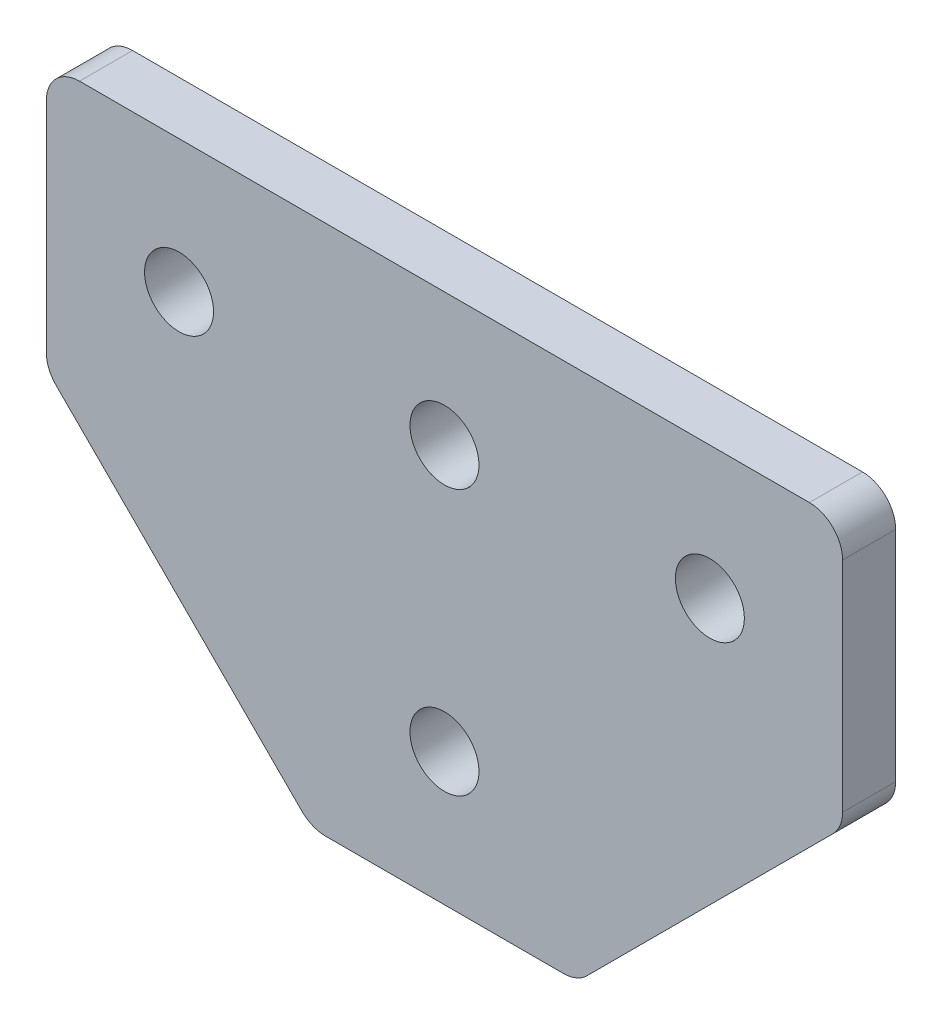
ISO-10303-21;
HEADER;
FILE_DESCRIPTION(('STEP AP214'),'2;1');
FILE_NAME('part.step','',(''),(''),'','','');
FILE_SCHEMA(('AUTOMOTIVE_DESIGN { 1 0 10303 214 1 1 1 1 }'));
ENDSEC;
DATA;
#1=APPLICATION_CONTEXT('core data for automotive mechanical design processes');
#2=APPLICATION_PROTOCOL_DEFINITION('international standard','automotive_design',2000,#1);
#3=PRODUCT_CONTEXT('',#1,'mechanical');
#4=PRODUCT('Part','Part','',(#3));
#5=PRODUCT_RELATED_PRODUCT_CATEGORY('part','',(#4));
#6=PRODUCT_DEFINITION_FORMATION('','',#4);
#7=PRODUCT_DEFINITION_CONTEXT('part definition',#1,'design');
#8=PRODUCT_DEFINITION('design','',#6,#7);
#9=PRODUCT_DEFINITION_SHAPE('','',#8);
#10=(LENGTH_UNIT() NAMED_UNIT(*) SI_UNIT(.MILLI.,.METRE.));
#11=(NAMED_UNIT(*) PLANE_ANGLE_UNIT() SI_UNIT($,.RADIAN.));
#12=(NAMED_UNIT(*) SI_UNIT($,.STERADIAN.) SOLID_ANGLE_UNIT());
#13=UNCERTAINTY_MEASURE_WITH_UNIT(LENGTH_MEASURE(1.E-05),#10,'distance_accuracy_value','');
#14=(GEOMETRIC_REPRESENTATION_CONTEXT(3) GLOBAL_UNCERTAINTY_ASSIGNED_CONTEXT((#13)) GLOBAL_UNIT_ASSIGNED_CONTEXT((#10,
#11,#12)) REPRESENTATION_CONTEXT('',''));
#15=CARTESIAN_POINT('',(0.,0.,0.));
#16=DIRECTION('',(0.,0.,1.));
#17=DIRECTION('',(1.,0.,0.));
#18=AXIS2_PLACEMENT_3D('',#15,#16,#17);
#19=CARTESIAN_POINT('',(2.5,-18.9644660940673,4.));
#20=DIRECTION('',(0.,0.,1.));
#21=DIRECTION('',(1.,0.,0.));
#22=AXIS2_PLACEMENT_3D('',#19,#20,#21);
#23=PLANE('',#22);
#24=CARTESIAN_POINT('',(50.,-10.,4.));
#25=DIRECTION('',(0.,0.,1.));
#26=DIRECTION('',(1.,0.,0.));
#27=AXIS2_PLACEMENT_3D('',#24,#25,#26);
#28=CIRCLE('',#27,2.6);
#29=CARTESIAN_POINT('',(52.6,-10.,4.));
#30=VERTEX_POINT('',#29);
#31=EDGE_CURVE('E332',#30,#30,#28,.T.);
#32=ORIENTED_EDGE('',*,*,#31,.F.);
#33=EDGE_LOOP('',(#32));
#34=FACE_BOUND('',#33,.T.);
#35=CARTESIAN_POINT('',(10.,-10.,4.));
#36=DIRECTION('',(0.,0.,1.));
#37=DIRECTION('',(1.,0.,0.));
#38=AXIS2_PLACEMENT_3D('',#35,#36,#37);
#39=CIRCLE('',#38,2.6);
#40=CARTESIAN_POINT('',(12.6,-10.,4.));
#41=VERTEX_POINT('',#40);
#42=EDGE_CURVE('E170',#41,#41,#39,.T.);
#43=ORIENTED_EDGE('',*,*,#42,.F.);
#44=EDGE_LOOP('',(#43));
#45=FACE_BOUND('',#44,.T.);
#46=CARTESIAN_POINT('',(2.5,-18.9644660940673,4.));
#47=DIRECTION('',(0.,0.,1.));
#48=DIRECTION('',(1.,0.,0.));
#49=AXIS2_PLACEMENT_3D('',#46,#47,#48);
#50=CIRCLE('',#49,2.5);
#51=CARTESIAN_POINT('',(0.,-18.9644660940673,4.));
#52=VERTEX_POINT('',#51);
#53=CARTESIAN_POINT('',(0.732233047033641,-20.7322330470336,4.));
#54=VERTEX_POINT('',#53);
#55=EDGE_CURVE('E200',#52,#54,#50,.T.);
#56=ORIENTED_EDGE('',*,*,#55,.T.);
#57=DIRECTION('',(0.707106781186547,-0.707106781186547,0.));
#58=VECTOR('',#57,1.);
#59=CARTESIAN_POINT('',(0.732233047033641,-20.7322330470336,4.));
#60=LINE('',#59,#58);
#61=CARTESIAN_POINT('',(19.2677669529664,-39.2677669529664,4.));
#62=VERTEX_POINT('',#61);
#63=EDGE_CURVE('E112',#54,#62,#60,.T.);
#64=ORIENTED_EDGE('',*,*,#63,.T.);
#65=CARTESIAN_POINT('',(21.0355339059327,-37.5,4.));
#66=DIRECTION('',(0.,0.,1.));
#67=DIRECTION('',(1.,0.,0.));
#68=AXIS2_PLACEMENT_3D('',#65,#66,#67);
#69=CIRCLE('',#68,2.5);
#70=CARTESIAN_POINT('',(21.0355339059328,-40.,4.));
#71=VERTEX_POINT('',#70);
#72=EDGE_CURVE('E237',#62,#71,#69,.T.);
#73=ORIENTED_EDGE('',*,*,#72,.T.);
#74=DIRECTION('',(1.,0.,0.));
#75=VECTOR('',#74,1.);
#76=CARTESIAN_POINT('',(21.0355339059328,-40.,4.));
#77=LINE('',#76,#75);
#78=CARTESIAN_POINT('',(38.9644660940673,-40.,4.));
#79=VERTEX_POINT('',#78);
#80=EDGE_CURVE('E257',#71,#79,#77,.T.);
#81=ORIENTED_EDGE('',*,*,#80,.T.);
#82=CARTESIAN_POINT('',(38.9644660940673,-37.5,4.));
#83=DIRECTION('',(0.,0.,1.));
#84=DIRECTION('',(1.,0.,0.));
#85=AXIS2_PLACEMENT_3D('',#82,#83,#84);
#86=CIRCLE('',#85,2.5);
#87=CARTESIAN_POINT('',(40.7322330470336,-39.2677669529664,4.));
#88=VERTEX_POINT('',#87);
#89=EDGE_CURVE('E253',#79,#88,#86,.T.);
#90=ORIENTED_EDGE('',*,*,#89,.T.);
#91=DIRECTION('',(0.707106781186547,0.707106781186548,0.));
#92=VECTOR('',#91,1.);
#93=CARTESIAN_POINT('',(40.7322330470336,-39.2677669529664,4.));
#94=LINE('',#93,#92);
#95=CARTESIAN_POINT('',(59.2677669529664,-20.7322330470336,4.));
#96=VERTEX_POINT('',#95);
#97=EDGE_CURVE('E256',#88,#96,#94,.T.);
#98=ORIENTED_EDGE('',*,*,#97,.T.);
#99=CARTESIAN_POINT('',(57.5,-18.9644660940673,4.));
#100=DIRECTION('',(0.,0.,1.));
#101=DIRECTION('',(-1.,0.,0.));
#102=AXIS2_PLACEMENT_3D('',#99,#100,#101);
#103=CIRCLE('',#102,2.5);
#104=CARTESIAN_POINT('',(60.,-18.9644660940673,4.));
#105=VERTEX_POINT('',#104);
#106=EDGE_CURVE('E261',#96,#105,#103,.T.);
#107=ORIENTED_EDGE('',*,*,#106,.T.);
#108=DIRECTION('',(0.,1.,0.));
#109=VECTOR('',#108,1.);
#110=CARTESIAN_POINT('',(60.,-2.50000000000002,4.));
#111=LINE('',#110,#109);
#112=CARTESIAN_POINT('',(60.,-2.50000000000002,4.));
#113=VERTEX_POINT('',#112);
#114=EDGE_CURVE('E268',#105,#113,#111,.T.);
#115=ORIENTED_EDGE('',*,*,#114,.T.);
#116=CARTESIAN_POINT('',(57.5,-2.5,4.));
#117=DIRECTION('',(0.,0.,1.));
#118=DIRECTION('',(-1.,0.,0.));
#119=AXIS2_PLACEMENT_3D('',#116,#117,#118);
#120=CIRCLE('',#119,2.5);
#121=CARTESIAN_POINT('',(57.5,0.,4.));
#122=VERTEX_POINT('',#121);
#123=EDGE_CURVE('E143',#113,#122,#120,.T.);
#124=ORIENTED_EDGE('',*,*,#123,.T.);
#125=DIRECTION('',(-1.,0.,0.));
#126=VECTOR('',#125,1.);
#127=CARTESIAN_POINT('',(2.50000000000002,0.,4.));
#128=LINE('',#127,#126);
#129=CARTESIAN_POINT('',(2.50000000000002,0.,4.));
#130=VERTEX_POINT('',#129);
#131=EDGE_CURVE('E137',#122,#130,#128,.T.);
#132=ORIENTED_EDGE('',*,*,#131,.T.);
#133=CARTESIAN_POINT('',(2.5,-2.5,4.));
#134=DIRECTION('',(0.,0.,1.));
#135=DIRECTION('',(1.,0.,0.));
#136=AXIS2_PLACEMENT_3D('',#133,#134,#135);
#137=CIRCLE('',#136,2.5);
#138=CARTESIAN_POINT('',(0.,-2.50000000000002,4.));
#139=VERTEX_POINT('',#138);
#140=EDGE_CURVE('E141',#130,#139,#137,.T.);
#141=ORIENTED_EDGE('',*,*,#140,.T.);
#142=DIRECTION('',(0.,-1.,0.));
#143=VECTOR('',#142,1.);
#144=CARTESIAN_POINT('',(0.,-2.50000000000002,4.));
#145=LINE('',#144,#143);
#146=EDGE_CURVE('E57',#139,#52,#145,.T.);
#147=ORIENTED_EDGE('',*,*,#146,.T.);
#148=EDGE_LOOP('',(#56,#64,#73,#81,#90,#98,#107,#115,#124,#132,#141,#147));
#149=FACE_BOUND('',#148,.T.);
#150=CARTESIAN_POINT('',(30.,-10.,4.));
#151=DIRECTION('',(0.,0.,1.));
#152=DIRECTION('',(1.,0.,0.));
#153=AXIS2_PLACEMENT_3D('',#150,#151,#152);
#154=CIRCLE('',#153,2.6);
#155=CARTESIAN_POINT('',(32.6,-10.,4.));
#156=VERTEX_POINT('',#155);
#157=EDGE_CURVE('E340',#156,#156,#154,.T.);
#158=ORIENTED_EDGE('',*,*,#157,.F.);
#159=EDGE_LOOP('',(#158));
#160=FACE_BOUND('',#159,.T.);
#161=CARTESIAN_POINT('',(30.0000000000002,-30.,4.));
#162=DIRECTION('',(0.,0.,1.));
#163=DIRECTION('',(1.,0.,0.));
#164=AXIS2_PLACEMENT_3D('',#161,#162,#163);
#165=CIRCLE('',#164,2.6);
#166=CARTESIAN_POINT('',(32.6000000000002,-30.,4.));
#167=VERTEX_POINT('',#166);
#168=EDGE_CURVE('E321',#167,#167,#165,.T.);
#169=ORIENTED_EDGE('',*,*,#168,.F.);
#170=EDGE_LOOP('',(#169));
#171=FACE_BOUND('',#170,.T.);
#172=ADVANCED_FACE('F39',(#34,#45,#149,#160,#171),#23,.T.);
#173=CARTESIAN_POINT('',(2.5,-18.9644660940673,0.));
#174=DIRECTION('',(0.,0.,1.));
#175=DIRECTION('',(1.,0.,0.));
#176=AXIS2_PLACEMENT_3D('',#173,#174,#175);
#177=PLANE('',#176);
#178=CARTESIAN_POINT('',(2.5,-18.9644660940673,0.));
#179=DIRECTION('',(0.,0.,1.));
#180=DIRECTION('',(1.,0.,0.));
#181=AXIS2_PLACEMENT_3D('',#178,#179,#180);
#182=CIRCLE('',#181,2.5);
#183=CARTESIAN_POINT('',(0.,-18.9644660940673,0.));
#184=VERTEX_POINT('',#183);
#185=CARTESIAN_POINT('',(0.732233047033641,-20.7322330470336,0.));
#186=VERTEX_POINT('',#185);
#187=EDGE_CURVE('E165',#184,#186,#182,.T.);
#188=ORIENTED_EDGE('',*,*,#187,.F.);
#189=DIRECTION('',(0.,-1.,0.));
#190=VECTOR('',#189,1.);
#191=CARTESIAN_POINT('',(0.,-2.50000000000002,0.));
#192=LINE('',#191,#190);
#193=CARTESIAN_POINT('',(0.,-2.50000000000002,0.));
#194=VERTEX_POINT('',#193);
#195=EDGE_CURVE('E104',#194,#184,#192,.T.);
#196=ORIENTED_EDGE('',*,*,#195,.F.);
#197=CARTESIAN_POINT('',(2.5,-2.5,0.));
#198=DIRECTION('',(0.,0.,1.));
#199=DIRECTION('',(1.,0.,0.));
#200=AXIS2_PLACEMENT_3D('',#197,#198,#199);
#201=CIRCLE('',#200,2.5);
#202=CARTESIAN_POINT('',(2.50000000000002,0.,0.));
#203=VERTEX_POINT('',#202);
#204=EDGE_CURVE('E98',#203,#194,#201,.T.);
#205=ORIENTED_EDGE('',*,*,#204,.F.);
#206=DIRECTION('',(-1.,0.,0.));
#207=VECTOR('',#206,1.);
#208=CARTESIAN_POINT('',(2.50000000000002,0.,0.));
#209=LINE('',#208,#207);
#210=CARTESIAN_POINT('',(57.5,0.,0.));
#211=VERTEX_POINT('',#210);
#212=EDGE_CURVE('E152',#211,#203,#209,.T.);
#213=ORIENTED_EDGE('',*,*,#212,.F.);
#214=CARTESIAN_POINT('',(57.5,-2.5,0.));
#215=DIRECTION('',(0.,0.,1.));
#216=DIRECTION('',(-1.,0.,0.));
#217=AXIS2_PLACEMENT_3D('',#214,#215,#216);
#218=CIRCLE('',#217,2.5);
#219=CARTESIAN_POINT('',(60.,-2.50000000000002,0.));
#220=VERTEX_POINT('',#219);
#221=EDGE_CURVE('E191',#220,#211,#218,.T.);
#222=ORIENTED_EDGE('',*,*,#221,.F.);
#223=DIRECTION('',(0.,1.,0.));
#224=VECTOR('',#223,1.);
#225=CARTESIAN_POINT('',(60.,-2.50000000000002,0.));
#226=LINE('',#225,#224);
#227=CARTESIAN_POINT('',(60.,-18.9644660940673,0.));
#228=VERTEX_POINT('',#227);
#229=EDGE_CURVE('E188',#228,#220,#226,.T.);
#230=ORIENTED_EDGE('',*,*,#229,.F.);
#231=CARTESIAN_POINT('',(57.5,-18.9644660940673,0.));
#232=DIRECTION('',(0.,0.,1.));
#233=DIRECTION('',(-1.,0.,0.));
#234=AXIS2_PLACEMENT_3D('',#231,#232,#233);
#235=CIRCLE('',#234,2.5);
#236=CARTESIAN_POINT('',(59.2677669529664,-20.7322330470336,0.));
#237=VERTEX_POINT('',#236);
#238=EDGE_CURVE('E185',#237,#228,#235,.T.);
#239=ORIENTED_EDGE('',*,*,#238,.F.);
#240=DIRECTION('',(0.707106781186547,0.707106781186548,0.));
#241=VECTOR('',#240,1.);
#242=CARTESIAN_POINT('',(40.7322330470336,-39.2677669529664,0.));
#243=LINE('',#242,#241);
#244=CARTESIAN_POINT('',(40.7322330470336,-39.2677669529664,0.));
#245=VERTEX_POINT('',#244);
#246=EDGE_CURVE('E182',#245,#237,#243,.T.);
#247=ORIENTED_EDGE('',*,*,#246,.F.);
#248=CARTESIAN_POINT('',(38.9644660940673,-37.5,0.));
#249=DIRECTION('',(0.,0.,1.));
#250=DIRECTION('',(1.,0.,0.));
#251=AXIS2_PLACEMENT_3D('',#248,#249,#250);
#252=CIRCLE('',#251,2.5);
#253=CARTESIAN_POINT('',(38.9644660940673,-40.,0.));
#254=VERTEX_POINT('',#253);
#255=EDGE_CURVE('E179',#254,#245,#252,.T.);
#256=ORIENTED_EDGE('',*,*,#255,.F.);
#257=DIRECTION('',(1.,0.,0.));
#258=VECTOR('',#257,1.);
#259=CARTESIAN_POINT('',(21.0355339059328,-40.,0.));
#260=LINE('',#259,#258);
#261=CARTESIAN_POINT('',(21.0355339059328,-40.,0.));
#262=VERTEX_POINT('',#261);
#263=EDGE_CURVE('E176',#262,#254,#260,.T.);
#264=ORIENTED_EDGE('',*,*,#263,.F.);
#265=CARTESIAN_POINT('',(21.0355339059327,-37.5,0.));
#266=DIRECTION('',(0.,0.,1.));
#267=DIRECTION('',(1.,0.,0.));
#268=AXIS2_PLACEMENT_3D('',#265,#266,#267);
#269=CIRCLE('',#268,2.5);
#270=CARTESIAN_POINT('',(19.2677669529664,-39.2677669529664,0.));
#271=VERTEX_POINT('',#270);
#272=EDGE_CURVE('E173',#271,#262,#269,.T.);
#273=ORIENTED_EDGE('',*,*,#272,.F.);
#274=DIRECTION('',(0.707106781186547,-0.707106781186547,0.));
#275=VECTOR('',#274,1.);
#276=CARTESIAN_POINT('',(0.732233047033641,-20.7322330470336,0.));
#277=LINE('',#276,#275);
#278=EDGE_CURVE('E169',#186,#271,#277,.T.);
#279=ORIENTED_EDGE('',*,*,#278,.F.);
#280=EDGE_LOOP('',(#188,#196,#205,#213,#222,#230,#239,#247,#256,#264,#273,#279));
#281=FACE_BOUND('',#280,.T.);
#282=CARTESIAN_POINT('',(10.,-10.,0.));
#283=DIRECTION('',(0.,0.,1.));
#284=DIRECTION('',(1.,0.,0.));
#285=AXIS2_PLACEMENT_3D('',#282,#283,#284);
#286=CIRCLE('',#285,2.6);
#287=CARTESIAN_POINT('',(12.6,-10.,0.));
#288=VERTEX_POINT('',#287);
#289=EDGE_CURVE('E344',#288,#288,#286,.T.);
#290=ORIENTED_EDGE('',*,*,#289,.T.);
#291=EDGE_LOOP('',(#290));
#292=FACE_BOUND('',#291,.T.);
#293=CARTESIAN_POINT('',(30.,-10.,0.));
#294=DIRECTION('',(0.,0.,1.));
#295=DIRECTION('',(1.,0.,0.));
#296=AXIS2_PLACEMENT_3D('',#293,#294,#295);
#297=CIRCLE('',#296,2.6);
#298=CARTESIAN_POINT('',(32.6,-10.,0.));
#299=VERTEX_POINT('',#298);
#300=EDGE_CURVE('E336',#299,#299,#297,.T.);
#301=ORIENTED_EDGE('',*,*,#300,.T.);
#302=EDGE_LOOP('',(#301));
#303=FACE_BOUND('',#302,.T.);
#304=CARTESIAN_POINT('',(50.,-10.,0.));
#305=DIRECTION('',(0.,0.,1.));
#306=DIRECTION('',(1.,0.,0.));
#307=AXIS2_PLACEMENT_3D('',#304,#305,#306);
#308=CIRCLE('',#307,2.6);
#309=CARTESIAN_POINT('',(52.6,-10.,0.));
#310=VERTEX_POINT('',#309);
#311=EDGE_CURVE('E329',#310,#310,#308,.T.);
#312=ORIENTED_EDGE('',*,*,#311,.T.);
#313=EDGE_LOOP('',(#312));
#314=FACE_BOUND('',#313,.T.);
#315=CARTESIAN_POINT('',(30.0000000000002,-30.,0.));
#316=DIRECTION('',(0.,0.,1.));
#317=DIRECTION('',(1.,0.,0.));
#318=AXIS2_PLACEMENT_3D('',#315,#316,#317);
#319=CIRCLE('',#318,2.6);
#320=CARTESIAN_POINT('',(32.6000000000002,-30.,0.));
#321=VERTEX_POINT('',#320);
#322=EDGE_CURVE('E324',#321,#321,#319,.T.);
#323=ORIENTED_EDGE('',*,*,#322,.T.);
#324=EDGE_LOOP('',(#323));
#325=FACE_BOUND('',#324,.T.);
#326=ADVANCED_FACE('F241',(#281,#292,#303,#314,#325),#177,.F.);
#327=CARTESIAN_POINT('',(2.5,-18.9644660940673,4.));
#328=DIRECTION('',(0.,0.,-1.));
#329=DIRECTION('',(-1.,0.,0.));
#330=AXIS2_PLACEMENT_3D('',#327,#328,#329);
#331=CYLINDRICAL_SURFACE('',#330,2.5);
#332=ORIENTED_EDGE('',*,*,#187,.T.);
#333=DIRECTION('',(0.,0.,-1.));
#334=VECTOR('',#333,1.);
#335=CARTESIAN_POINT('',(0.732233047033641,-20.7322330470336,4.));
#336=LINE('',#335,#334);
#337=EDGE_CURVE('E11',#54,#186,#336,.T.);
#338=ORIENTED_EDGE('',*,*,#337,.F.);
#339=ORIENTED_EDGE('',*,*,#55,.F.);
#340=DIRECTION('',(0.,0.,-1.));
#341=VECTOR('',#340,1.);
#342=CARTESIAN_POINT('',(0.,-18.9644660940673,4.));
#343=LINE('',#342,#341);
#344=EDGE_CURVE('E161',#52,#184,#343,.T.);
#345=ORIENTED_EDGE('',*,*,#344,.T.);
#346=EDGE_LOOP('',(#332,#338,#339,#345));
#347=FACE_BOUND('',#346,.T.);
#348=ADVANCED_FACE('F41',(#347),#331,.T.);
#349=CARTESIAN_POINT('',(0.732233047033641,-20.7322330470336,4.));
#350=DIRECTION('',(0.707106781186548,0.707106781186548,0.));
#351=DIRECTION('',(-0.707106781186548,0.707106781186547,0.));
#352=AXIS2_PLACEMENT_3D('',#349,#350,#351);
#353=PLANE('',#352);
#354=ORIENTED_EDGE('',*,*,#278,.T.);
#355=DIRECTION('',(0.,0.,-1.));
#356=VECTOR('',#355,1.);
#357=CARTESIAN_POINT('',(19.2677669529664,-39.2677669529664,4.));
#358=LINE('',#357,#356);
#359=EDGE_CURVE('E49',#62,#271,#358,.T.);
#360=ORIENTED_EDGE('',*,*,#359,.F.);
#361=ORIENTED_EDGE('',*,*,#63,.F.);
#362=ORIENTED_EDGE('',*,*,#337,.T.);
#363=EDGE_LOOP('',(#354,#360,#361,#362));
#364=FACE_BOUND('',#363,.T.);
#365=ADVANCED_FACE('F460',(#364),#353,.F.);
#366=CARTESIAN_POINT('',(21.0355339059327,-37.5,4.));
#367=DIRECTION('',(0.,0.,-1.));
#368=DIRECTION('',(-1.,0.,0.));
#369=AXIS2_PLACEMENT_3D('',#366,#367,#368);
#370=CYLINDRICAL_SURFACE('',#369,2.5);
#371=ORIENTED_EDGE('',*,*,#272,.T.);
#372=DIRECTION('',(0.,0.,-1.));
#373=VECTOR('',#372,1.);
#374=CARTESIAN_POINT('',(21.0355339059328,-40.,4.));
#375=LINE('',#374,#373);
#376=EDGE_CURVE('E227',#71,#262,#375,.T.);
#377=ORIENTED_EDGE('',*,*,#376,.F.);
#378=ORIENTED_EDGE('',*,*,#72,.F.);
#379=ORIENTED_EDGE('',*,*,#359,.T.);
#380=EDGE_LOOP('',(#371,#377,#378,#379));
#381=FACE_BOUND('',#380,.T.);
#382=ADVANCED_FACE('F235',(#381),#370,.T.);
#383=CARTESIAN_POINT('',(21.0355339059328,-40.,4.));
#384=DIRECTION('',(0.,1.,0.));
#385=DIRECTION('',(-1.,0.,0.));
#386=AXIS2_PLACEMENT_3D('',#383,#384,#385);
#387=PLANE('',#386);
#388=ORIENTED_EDGE('',*,*,#263,.T.);
#389=DIRECTION('',(0.,0.,-1.));
#390=VECTOR('',#389,1.);
#391=CARTESIAN_POINT('',(38.9644660940673,-40.,4.));
#392=LINE('',#391,#390);
#393=EDGE_CURVE('E223',#79,#254,#392,.T.);
#394=ORIENTED_EDGE('',*,*,#393,.F.);
#395=ORIENTED_EDGE('',*,*,#80,.F.);
#396=ORIENTED_EDGE('',*,*,#376,.T.);
#397=EDGE_LOOP('',(#388,#394,#395,#396));
#398=FACE_BOUND('',#397,.T.);
#399=ADVANCED_FACE('F247',(#398),#387,.F.);
#400=CARTESIAN_POINT('',(38.9644660940673,-37.5,4.));
#401=DIRECTION('',(0.,0.,-1.));
#402=DIRECTION('',(-1.,0.,0.));
#403=AXIS2_PLACEMENT_3D('',#400,#401,#402);
#404=CYLINDRICAL_SURFACE('',#403,2.5);
#405=ORIENTED_EDGE('',*,*,#255,.T.);
#406=DIRECTION('',(0.,0.,-1.));
#407=VECTOR('',#406,1.);
#408=CARTESIAN_POINT('',(40.7322330470336,-39.2677669529664,4.));
#409=LINE('',#408,#407);
#410=EDGE_CURVE('E219',#88,#245,#409,.T.);
#411=ORIENTED_EDGE('',*,*,#410,.F.);
#412=ORIENTED_EDGE('',*,*,#89,.F.);
#413=ORIENTED_EDGE('',*,*,#393,.T.);
#414=EDGE_LOOP('',(#405,#411,#412,#413));
#415=FACE_BOUND('',#414,.T.);
#416=ADVANCED_FACE('F251',(#415),#404,.T.);
#417=CARTESIAN_POINT('',(40.7322330470336,-39.2677669529664,4.));
#418=DIRECTION('',(-0.707106781186548,0.707106781186547,0.));
#419=DIRECTION('',(-0.707106781186547,-0.707106781186548,0.));
#420=AXIS2_PLACEMENT_3D('',#417,#418,#419);
#421=PLANE('',#420);
#422=ORIENTED_EDGE('',*,*,#246,.T.);
#423=DIRECTION('',(0.,0.,-1.));
#424=VECTOR('',#423,1.);
#425=CARTESIAN_POINT('',(59.2677669529664,-20.7322330470336,4.));
#426=LINE('',#425,#424);
#427=EDGE_CURVE('E215',#96,#237,#426,.T.);
#428=ORIENTED_EDGE('',*,*,#427,.F.);
#429=ORIENTED_EDGE('',*,*,#97,.F.);
#430=ORIENTED_EDGE('',*,*,#410,.T.);
#431=EDGE_LOOP('',(#422,#428,#429,#430));
#432=FACE_BOUND('',#431,.T.);
#433=ADVANCED_FACE('F425',(#432),#421,.F.);
#434=CARTESIAN_POINT('',(57.5,-18.9644660940673,4.));
#435=DIRECTION('',(0.,0.,-1.));
#436=DIRECTION('',(-1.,0.,0.));
#437=AXIS2_PLACEMENT_3D('',#434,#435,#436);
#438=CYLINDRICAL_SURFACE('',#437,2.5);
#439=ORIENTED_EDGE('',*,*,#238,.T.);
#440=DIRECTION('',(0.,0.,-1.));
#441=VECTOR('',#440,1.);
#442=CARTESIAN_POINT('',(60.,-18.9644660940673,4.));
#443=LINE('',#442,#441);
#444=EDGE_CURVE('E211',#105,#228,#443,.T.);
#445=ORIENTED_EDGE('',*,*,#444,.F.);
#446=ORIENTED_EDGE('',*,*,#106,.F.);
#447=ORIENTED_EDGE('',*,*,#427,.T.);
#448=EDGE_LOOP('',(#439,#445,#446,#447));
#449=FACE_BOUND('',#448,.T.);
#450=ADVANCED_FACE('F416',(#449),#438,.T.);
#451=CARTESIAN_POINT('',(60.,-2.50000000000002,4.));
#452=DIRECTION('',(-1.,0.,0.));
#453=DIRECTION('',(0.,0.,1.));
#454=AXIS2_PLACEMENT_3D('',#451,#452,#453);
#455=PLANE('',#454);
#456=ORIENTED_EDGE('',*,*,#229,.T.);
#457=DIRECTION('',(0.,0.,-1.));
#458=VECTOR('',#457,1.);
#459=CARTESIAN_POINT('',(60.,-2.50000000000002,4.));
#460=LINE('',#459,#458);
#461=EDGE_CURVE('E207',#113,#220,#460,.T.);
#462=ORIENTED_EDGE('',*,*,#461,.F.);
#463=ORIENTED_EDGE('',*,*,#114,.F.);
#464=ORIENTED_EDGE('',*,*,#444,.T.);
#465=EDGE_LOOP('',(#456,#462,#463,#464));
#466=FACE_BOUND('',#465,.T.);
#467=ADVANCED_FACE('F276',(#466),#455,.F.);
#468=CARTESIAN_POINT('',(57.5,-2.5,4.));
#469=DIRECTION('',(0.,0.,-1.));
#470=DIRECTION('',(-1.,0.,0.));
#471=AXIS2_PLACEMENT_3D('',#468,#469,#470);
#472=CYLINDRICAL_SURFACE('',#471,2.5);
#473=ORIENTED_EDGE('',*,*,#221,.T.);
#474=DIRECTION('',(0.,0.,-1.));
#475=VECTOR('',#474,1.);
#476=CARTESIAN_POINT('',(57.5,0.,4.));
#477=LINE('',#476,#475);
#478=EDGE_CURVE('E154',#122,#211,#477,.T.);
#479=ORIENTED_EDGE('',*,*,#478,.F.);
#480=ORIENTED_EDGE('',*,*,#123,.F.);
#481=ORIENTED_EDGE('',*,*,#461,.T.);
#482=EDGE_LOOP('',(#473,#479,#480,#481));
#483=FACE_BOUND('',#482,.T.);
#484=ADVANCED_FACE('F280',(#483),#472,.T.);
#485=CARTESIAN_POINT('',(2.50000000000002,0.,4.));
#486=DIRECTION('',(0.,-1.,0.));
#487=DIRECTION('',(0.,0.,-1.));
#488=AXIS2_PLACEMENT_3D('',#485,#486,#487);
#489=PLANE('',#488);
#490=ORIENTED_EDGE('',*,*,#212,.T.);
#491=DIRECTION('',(0.,0.,-1.));
#492=VECTOR('',#491,1.);
#493=CARTESIAN_POINT('',(2.50000000000002,0.,4.));
#494=LINE('',#493,#492);
#495=EDGE_CURVE('E149',#130,#203,#494,.T.);
#496=ORIENTED_EDGE('',*,*,#495,.F.);
#497=ORIENTED_EDGE('',*,*,#131,.F.);
#498=ORIENTED_EDGE('',*,*,#478,.T.);
#499=EDGE_LOOP('',(#490,#496,#497,#498));
#500=FACE_BOUND('',#499,.T.);
#501=ADVANCED_FACE('F150',(#500),#489,.F.);
#502=CARTESIAN_POINT('',(2.5,-2.5,4.));
#503=DIRECTION('',(0.,0.,-1.));
#504=DIRECTION('',(-1.,0.,0.));
#505=AXIS2_PLACEMENT_3D('',#502,#503,#504);
#506=CYLINDRICAL_SURFACE('',#505,2.5);
#507=ORIENTED_EDGE('',*,*,#204,.T.);
#508=DIRECTION('',(0.,0.,-1.));
#509=VECTOR('',#508,1.);
#510=CARTESIAN_POINT('',(0.,-2.50000000000002,4.));
#511=LINE('',#510,#509);
#512=EDGE_CURVE('E155',#139,#194,#511,.T.);
#513=ORIENTED_EDGE('',*,*,#512,.F.);
#514=ORIENTED_EDGE('',*,*,#140,.F.);
#515=ORIENTED_EDGE('',*,*,#495,.T.);
#516=EDGE_LOOP('',(#507,#513,#514,#515));
#517=FACE_BOUND('',#516,.T.);
#518=ADVANCED_FACE('F157',(#517),#506,.T.);
#519=CARTESIAN_POINT('',(0.,-2.50000000000002,4.));
#520=DIRECTION('',(1.,0.,0.));
#521=DIRECTION('',(0.,1.,0.));
#522=AXIS2_PLACEMENT_3D('',#519,#520,#521);
#523=PLANE('',#522);
#524=ORIENTED_EDGE('',*,*,#195,.T.);
#525=ORIENTED_EDGE('',*,*,#344,.F.);
#526=ORIENTED_EDGE('',*,*,#146,.F.);
#527=ORIENTED_EDGE('',*,*,#512,.T.);
#528=EDGE_LOOP('',(#524,#525,#526,#527));
#529=FACE_BOUND('',#528,.T.);
#530=ADVANCED_FACE('F284',(#529),#523,.F.);
#531=CARTESIAN_POINT('',(10.,-10.,4.));
#532=DIRECTION('',(0.,0.,-1.));
#533=DIRECTION('',(-1.,0.,0.));
#534=AXIS2_PLACEMENT_3D('',#531,#532,#533);
#535=CYLINDRICAL_SURFACE('',#534,2.6);
#536=ORIENTED_EDGE('',*,*,#42,.T.);
#537=EDGE_LOOP('',(#536));
#538=FACE_BOUND('',#537,.T.);
#539=ORIENTED_EDGE('',*,*,#289,.F.);
#540=EDGE_LOOP('',(#539));
#541=FACE_BOUND('',#540,.T.);
#542=ADVANCED_FACE('F286',(#538,#541),#535,.F.);
#543=CARTESIAN_POINT('',(30.,-10.,4.));
#544=DIRECTION('',(0.,0.,-1.));
#545=DIRECTION('',(-1.,0.,0.));
#546=AXIS2_PLACEMENT_3D('',#543,#544,#545);
#547=CYLINDRICAL_SURFACE('',#546,2.6);
#548=ORIENTED_EDGE('',*,*,#157,.T.);
#549=EDGE_LOOP('',(#548));
#550=FACE_BOUND('',#549,.T.);
#551=ORIENTED_EDGE('',*,*,#300,.F.);
#552=EDGE_LOOP('',(#551));
#553=FACE_BOUND('',#552,.T.);
#554=ADVANCED_FACE('F292',(#550,#553),#547,.F.);
#555=CARTESIAN_POINT('',(50.,-10.,4.));
#556=DIRECTION('',(0.,0.,-1.));
#557=DIRECTION('',(-1.,0.,0.));
#558=AXIS2_PLACEMENT_3D('',#555,#556,#557);
#559=CYLINDRICAL_SURFACE('',#558,2.6);
#560=ORIENTED_EDGE('',*,*,#31,.T.);
#561=EDGE_LOOP('',(#560));
#562=FACE_BOUND('',#561,.T.);
#563=ORIENTED_EDGE('',*,*,#311,.F.);
#564=EDGE_LOOP('',(#563));
#565=FACE_BOUND('',#564,.T.);
#566=ADVANCED_FACE('F308',(#562,#565),#559,.F.);
#567=CARTESIAN_POINT('',(30.0000000000002,-30.,4.));
#568=DIRECTION('',(0.,0.,-1.));
#569=DIRECTION('',(-1.,0.,0.));
#570=AXIS2_PLACEMENT_3D('',#567,#568,#569);
#571=CYLINDRICAL_SURFACE('',#570,2.6);
#572=ORIENTED_EDGE('',*,*,#168,.T.);
#573=EDGE_LOOP('',(#572));
#574=FACE_BOUND('',#573,.T.);
#575=ORIENTED_EDGE('',*,*,#322,.F.);
#576=EDGE_LOOP('',(#575));
#577=FACE_BOUND('',#576,.T.);
#578=ADVANCED_FACE('F312',(#574,#577),#571,.F.);
#579=CLOSED_SHELL('',(#172,#326,#348,#365,#382,#399,#416,#433,#450,#467,#484,#501,#518,#530,
#542,#554,#566,#578));
#580=MANIFOLD_SOLID_BREP('B2',#579);
#581=ADVANCED_BREP_SHAPE_REPRESENTATION('',(#18,#580),#14);
#582=SHAPE_DEFINITION_REPRESENTATION(#9,#581);
ENDSEC;
END-ISO-10303-21;
